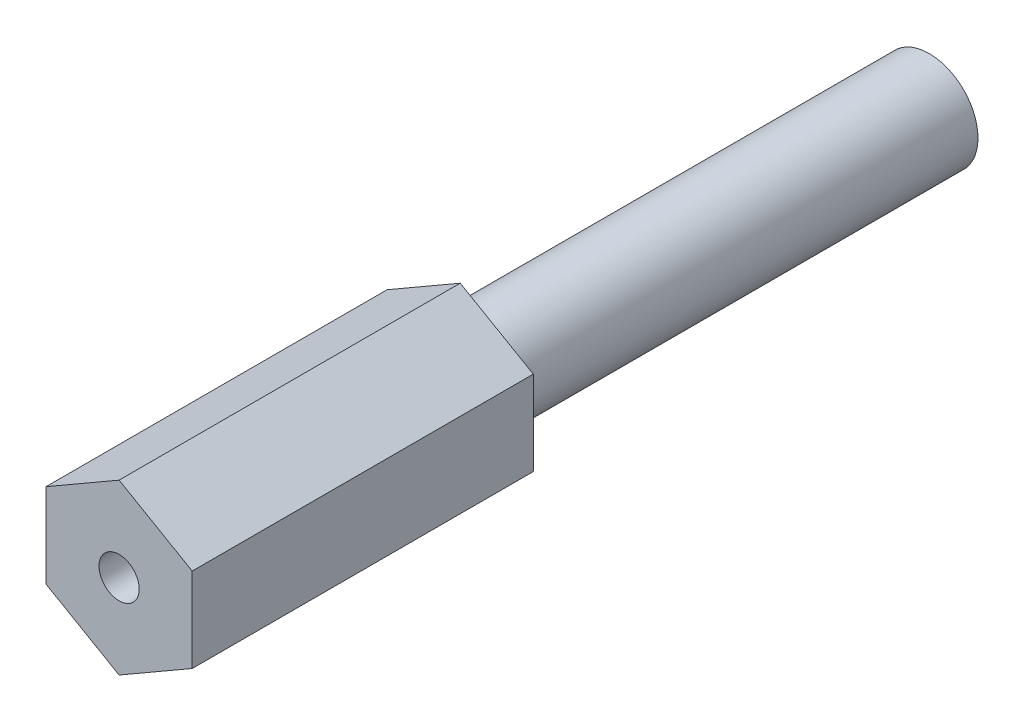
ISO-10303-21;
HEADER;
FILE_DESCRIPTION(('STEP AP214'),'2;1');
FILE_NAME('part.step','',(''),(''),'','','');
FILE_SCHEMA(('AUTOMOTIVE_DESIGN { 1 0 10303 214 1 1 1 1 }'));
ENDSEC;
DATA;
#1=APPLICATION_CONTEXT('core data for automotive mechanical design processes');
#2=APPLICATION_PROTOCOL_DEFINITION('international standard','automotive_design',2000,#1);
#3=PRODUCT_CONTEXT('',#1,'mechanical');
#4=PRODUCT('Part','Part','',(#3));
#5=PRODUCT_RELATED_PRODUCT_CATEGORY('part','',(#4));
#6=PRODUCT_DEFINITION_FORMATION('','',#4);
#7=PRODUCT_DEFINITION_CONTEXT('part definition',#1,'design');
#8=PRODUCT_DEFINITION('design','',#6,#7);
#9=PRODUCT_DEFINITION_SHAPE('','',#8);
#10=(LENGTH_UNIT() NAMED_UNIT(*) SI_UNIT(.MILLI.,.METRE.));
#11=(NAMED_UNIT(*) PLANE_ANGLE_UNIT() SI_UNIT($,.RADIAN.));
#12=(NAMED_UNIT(*) SI_UNIT($,.STERADIAN.) SOLID_ANGLE_UNIT());
#13=UNCERTAINTY_MEASURE_WITH_UNIT(LENGTH_MEASURE(1.E-05),#10,'distance_accuracy_value','');
#14=(GEOMETRIC_REPRESENTATION_CONTEXT(3) GLOBAL_UNCERTAINTY_ASSIGNED_CONTEXT((#13)) GLOBAL_UNIT_ASSIGNED_CONTEXT((#10,
#11,#12)) REPRESENTATION_CONTEXT('',''));
#15=CARTESIAN_POINT('',(0.,0.,0.));
#16=DIRECTION('',(0.,0.,1.));
#17=DIRECTION('',(1.,0.,0.));
#18=AXIS2_PLACEMENT_3D('',#15,#16,#17);
#19=CARTESIAN_POINT('',(-6.00000000000001,10.3923048454134,0.));
#20=DIRECTION('',(0.,0.,1.));
#21=DIRECTION('',(1.,0.,0.));
#22=AXIS2_PLACEMENT_3D('',#19,#20,#21);
#23=PLANE('',#22);
#24=DIRECTION('',(-0.866025403784439,0.499999999999999,0.));
#25=VECTOR('',#24,1.);
#26=CARTESIAN_POINT('',(5.99999999999999,3.46410161513795,0.));
#27=LINE('',#26,#25);
#28=CARTESIAN_POINT('',(5.99999999999999,3.46410161513795,0.));
#29=VERTEX_POINT('',#28);
#30=CARTESIAN_POINT('',(0.,6.92820323027571,0.));
#31=VERTEX_POINT('',#30);
#32=EDGE_CURVE('E114',#29,#31,#27,.T.);
#33=ORIENTED_EDGE('',*,*,#32,.F.);
#34=DIRECTION('',(0.,1.,0.));
#35=VECTOR('',#34,1.);
#36=CARTESIAN_POINT('',(5.99999999999999,-3.46410161513754,0.));
#37=LINE('',#36,#35);
#38=CARTESIAN_POINT('',(5.99999999999999,-3.46410161513754,0.));
#39=VERTEX_POINT('',#38);
#40=EDGE_CURVE('E125',#39,#29,#37,.T.);
#41=ORIENTED_EDGE('',*,*,#40,.F.);
#42=DIRECTION('',(0.866025403784439,0.499999999999999,0.));
#43=VECTOR('',#42,1.);
#44=CARTESIAN_POINT('',(0.,-6.92820323027528,0.));
#45=LINE('',#44,#43);
#46=CARTESIAN_POINT('',(0.,-6.92820323027528,0.));
#47=VERTEX_POINT('',#46);
#48=EDGE_CURVE('E123',#47,#39,#45,.T.);
#49=ORIENTED_EDGE('',*,*,#48,.F.);
#50=DIRECTION('',(0.866025403784439,-0.499999999999998,0.));
#51=VECTOR('',#50,1.);
#52=CARTESIAN_POINT('',(-6.00000000000001,-3.46410161513754,0.));
#53=LINE('',#52,#51);
#54=CARTESIAN_POINT('',(-6.00000000000001,-3.46410161513754,0.));
#55=VERTEX_POINT('',#54);
#56=EDGE_CURVE('E121',#55,#47,#53,.T.);
#57=ORIENTED_EDGE('',*,*,#56,.F.);
#58=DIRECTION('',(0.,-1.,0.));
#59=VECTOR('',#58,1.);
#60=CARTESIAN_POINT('',(-6.00000000000001,3.46410161513797,0.));
#61=LINE('',#60,#59);
#62=CARTESIAN_POINT('',(-6.00000000000001,3.46410161513797,0.));
#63=VERTEX_POINT('',#62);
#64=EDGE_CURVE('E119',#63,#55,#61,.T.);
#65=ORIENTED_EDGE('',*,*,#64,.F.);
#66=DIRECTION('',(-0.866025403784439,-0.5,0.));
#67=VECTOR('',#66,1.);
#68=CARTESIAN_POINT('',(0.,6.92820323027571,0.));
#69=LINE('',#68,#67);
#70=EDGE_CURVE('E117',#31,#63,#69,.T.);
#71=ORIENTED_EDGE('',*,*,#70,.F.);
#72=EDGE_LOOP('',(#33,#41,#49,#57,#65,#71));
#73=FACE_BOUND('',#72,.T.);
#74=CARTESIAN_POINT('',(0.,0.,0.));
#75=DIRECTION('',(0.,0.,1.));
#76=DIRECTION('',(1.,0.,0.));
#77=AXIS2_PLACEMENT_3D('',#74,#75,#76);
#78=CIRCLE('',#77,4.);
#79=CARTESIAN_POINT('',(4.,0.,0.));
#80=VERTEX_POINT('',#79);
#81=EDGE_CURVE('E11',#80,#80,#78,.F.);
#82=ORIENTED_EDGE('',*,*,#81,.F.);
#83=EDGE_LOOP('',(#82));
#84=FACE_BOUND('',#83,.T.);
#85=ADVANCED_FACE('F34',(#73,#84),#23,.F.);
#86=CARTESIAN_POINT('',(5.99999999999999,3.46410161513795,28.));
#87=DIRECTION('',(-0.499999999999999,-0.866025403784439,0.));
#88=DIRECTION('',(0.866025403784439,-0.5,0.));
#89=AXIS2_PLACEMENT_3D('',#86,#87,#88);
#90=PLANE('',#89);
#91=ORIENTED_EDGE('',*,*,#32,.T.);
#92=DIRECTION('',(0.,0.,-1.));
#93=VECTOR('',#92,1.);
#94=CARTESIAN_POINT('',(0.,6.92820323027571,28.));
#95=LINE('',#94,#93);
#96=CARTESIAN_POINT('',(0.,6.92820323027571,28.));
#97=VERTEX_POINT('',#96);
#98=EDGE_CURVE('E42',#97,#31,#95,.T.);
#99=ORIENTED_EDGE('',*,*,#98,.F.);
#100=DIRECTION('',(-0.866025403784439,0.499999999999999,0.));
#101=VECTOR('',#100,1.);
#102=CARTESIAN_POINT('',(5.99999999999999,3.46410161513795,28.));
#103=LINE('',#102,#101);
#104=CARTESIAN_POINT('',(5.99999999999999,3.46410161513795,28.));
#105=VERTEX_POINT('',#104);
#106=EDGE_CURVE('E127',#105,#97,#103,.T.);
#107=ORIENTED_EDGE('',*,*,#106,.F.);
#108=DIRECTION('',(0.,0.,-1.));
#109=VECTOR('',#108,1.);
#110=CARTESIAN_POINT('',(5.99999999999999,3.46410161513795,28.));
#111=LINE('',#110,#109);
#112=EDGE_CURVE('E137',#105,#29,#111,.T.);
#113=ORIENTED_EDGE('',*,*,#112,.T.);
#114=EDGE_LOOP('',(#91,#99,#107,#113));
#115=FACE_BOUND('',#114,.T.);
#116=ADVANCED_FACE('F36',(#115),#90,.F.);
#117=CARTESIAN_POINT('',(0.,6.92820323027571,28.));
#118=DIRECTION('',(0.5,-0.866025403784439,0.));
#119=DIRECTION('',(0.866025403784439,0.5,0.));
#120=AXIS2_PLACEMENT_3D('',#117,#118,#119);
#121=PLANE('',#120);
#122=ORIENTED_EDGE('',*,*,#70,.T.);
#123=DIRECTION('',(0.,0.,-1.));
#124=VECTOR('',#123,1.);
#125=CARTESIAN_POINT('',(-6.00000000000001,3.46410161513797,28.));
#126=LINE('',#125,#124);
#127=CARTESIAN_POINT('',(-6.00000000000001,3.46410161513797,28.));
#128=VERTEX_POINT('',#127);
#129=EDGE_CURVE('E149',#128,#63,#126,.T.);
#130=ORIENTED_EDGE('',*,*,#129,.F.);
#131=DIRECTION('',(-0.866025403784439,-0.5,0.));
#132=VECTOR('',#131,1.);
#133=CARTESIAN_POINT('',(0.,6.92820323027571,28.));
#134=LINE('',#133,#132);
#135=EDGE_CURVE('E129',#97,#128,#134,.T.);
#136=ORIENTED_EDGE('',*,*,#135,.F.);
#137=ORIENTED_EDGE('',*,*,#98,.T.);
#138=EDGE_LOOP('',(#122,#130,#136,#137));
#139=FACE_BOUND('',#138,.T.);
#140=ADVANCED_FACE('F154',(#139),#121,.F.);
#141=CARTESIAN_POINT('',(-6.00000000000001,3.46410161513797,28.));
#142=DIRECTION('',(1.,0.,0.));
#143=DIRECTION('',(0.,0.,-1.));
#144=AXIS2_PLACEMENT_3D('',#141,#142,#143);
#145=PLANE('',#144);
#146=ORIENTED_EDGE('',*,*,#64,.T.);
#147=DIRECTION('',(0.,0.,-1.));
#148=VECTOR('',#147,1.);
#149=CARTESIAN_POINT('',(-6.00000000000001,-3.46410161513754,28.));
#150=LINE('',#149,#148);
#151=CARTESIAN_POINT('',(-6.00000000000001,-3.46410161513754,28.));
#152=VERTEX_POINT('',#151);
#153=EDGE_CURVE('E146',#152,#55,#150,.T.);
#154=ORIENTED_EDGE('',*,*,#153,.F.);
#155=DIRECTION('',(0.,-1.,0.));
#156=VECTOR('',#155,1.);
#157=CARTESIAN_POINT('',(-6.00000000000001,3.46410161513797,28.));
#158=LINE('',#157,#156);
#159=EDGE_CURVE('E131',#128,#152,#158,.T.);
#160=ORIENTED_EDGE('',*,*,#159,.F.);
#161=ORIENTED_EDGE('',*,*,#129,.T.);
#162=EDGE_LOOP('',(#146,#154,#160,#161));
#163=FACE_BOUND('',#162,.T.);
#164=ADVANCED_FACE('F167',(#163),#145,.F.);
#165=CARTESIAN_POINT('',(-6.00000000000001,-3.46410161513754,28.));
#166=DIRECTION('',(0.499999999999998,0.866025403784439,0.));
#167=DIRECTION('',(-0.86602540378444,0.499999999999998,0.));
#168=AXIS2_PLACEMENT_3D('',#165,#166,#167);
#169=PLANE('',#168);
#170=ORIENTED_EDGE('',*,*,#56,.T.);
#171=DIRECTION('',(0.,0.,-1.));
#172=VECTOR('',#171,1.);
#173=CARTESIAN_POINT('',(0.,-6.92820323027528,28.));
#174=LINE('',#173,#172);
#175=CARTESIAN_POINT('',(0.,-6.92820323027528,28.));
#176=VERTEX_POINT('',#175);
#177=EDGE_CURVE('E143',#176,#47,#174,.T.);
#178=ORIENTED_EDGE('',*,*,#177,.F.);
#179=DIRECTION('',(0.866025403784439,-0.499999999999998,0.));
#180=VECTOR('',#179,1.);
#181=CARTESIAN_POINT('',(-6.00000000000001,-3.46410161513754,28.));
#182=LINE('',#181,#180);
#183=EDGE_CURVE('E133',#152,#176,#182,.T.);
#184=ORIENTED_EDGE('',*,*,#183,.F.);
#185=ORIENTED_EDGE('',*,*,#153,.T.);
#186=EDGE_LOOP('',(#170,#178,#184,#185));
#187=FACE_BOUND('',#186,.T.);
#188=ADVANCED_FACE('F171',(#187),#169,.F.);
#189=CARTESIAN_POINT('',(0.,-6.92820323027528,28.));
#190=DIRECTION('',(-0.499999999999999,0.866025403784439,0.));
#191=DIRECTION('',(-0.866025403784439,-0.5,0.));
#192=AXIS2_PLACEMENT_3D('',#189,#190,#191);
#193=PLANE('',#192);
#194=ORIENTED_EDGE('',*,*,#48,.T.);
#195=DIRECTION('',(0.,0.,-1.));
#196=VECTOR('',#195,1.);
#197=CARTESIAN_POINT('',(5.99999999999999,-3.46410161513754,28.));
#198=LINE('',#197,#196);
#199=CARTESIAN_POINT('',(5.99999999999999,-3.46410161513754,28.));
#200=VERTEX_POINT('',#199);
#201=EDGE_CURVE('E140',#200,#39,#198,.T.);
#202=ORIENTED_EDGE('',*,*,#201,.F.);
#203=DIRECTION('',(0.866025403784439,0.499999999999999,0.));
#204=VECTOR('',#203,1.);
#205=CARTESIAN_POINT('',(0.,-6.92820323027528,28.));
#206=LINE('',#205,#204);
#207=EDGE_CURVE('E54',#176,#200,#206,.T.);
#208=ORIENTED_EDGE('',*,*,#207,.F.);
#209=ORIENTED_EDGE('',*,*,#177,.T.);
#210=EDGE_LOOP('',(#194,#202,#208,#209));
#211=FACE_BOUND('',#210,.T.);
#212=ADVANCED_FACE('F186',(#211),#193,.F.);
#213=CARTESIAN_POINT('',(5.99999999999999,-3.46410161513754,28.));
#214=DIRECTION('',(-1.,0.,0.));
#215=DIRECTION('',(0.,0.,1.));
#216=AXIS2_PLACEMENT_3D('',#213,#214,#215);
#217=PLANE('',#216);
#218=ORIENTED_EDGE('',*,*,#40,.T.);
#219=ORIENTED_EDGE('',*,*,#112,.F.);
#220=DIRECTION('',(0.,1.,0.));
#221=VECTOR('',#220,1.);
#222=CARTESIAN_POINT('',(5.99999999999999,-3.46410161513754,28.));
#223=LINE('',#222,#221);
#224=EDGE_CURVE('E49',#200,#105,#223,.T.);
#225=ORIENTED_EDGE('',*,*,#224,.F.);
#226=ORIENTED_EDGE('',*,*,#201,.T.);
#227=EDGE_LOOP('',(#218,#219,#225,#226));
#228=FACE_BOUND('',#227,.T.);
#229=ADVANCED_FACE('F176',(#228),#217,.F.);
#230=CARTESIAN_POINT('',(-6.00000000000001,10.3923048454134,28.));
#231=DIRECTION('',(0.,0.,1.));
#232=DIRECTION('',(1.,0.,0.));
#233=AXIS2_PLACEMENT_3D('',#230,#231,#232);
#234=PLANE('',#233);
#235=CARTESIAN_POINT('',(0.,0.,28.));
#236=DIRECTION('',(0.,0.,1.));
#237=DIRECTION('',(1.,0.,0.));
#238=AXIS2_PLACEMENT_3D('',#235,#236,#237);
#239=CIRCLE('',#238,1.64999999999999);
#240=CARTESIAN_POINT('',(1.64999999999999,0.,28.));
#241=VERTEX_POINT('',#240);
#242=EDGE_CURVE('E108',#241,#241,#239,.T.);
#243=ORIENTED_EDGE('',*,*,#242,.F.);
#244=EDGE_LOOP('',(#243));
#245=FACE_BOUND('',#244,.T.);
#246=ORIENTED_EDGE('',*,*,#106,.T.);
#247=ORIENTED_EDGE('',*,*,#135,.T.);
#248=ORIENTED_EDGE('',*,*,#159,.T.);
#249=ORIENTED_EDGE('',*,*,#183,.T.);
#250=ORIENTED_EDGE('',*,*,#207,.T.);
#251=ORIENTED_EDGE('',*,*,#224,.T.);
#252=EDGE_LOOP('',(#246,#247,#248,#249,#250,#251));
#253=FACE_BOUND('',#252,.T.);
#254=ADVANCED_FACE('F173',(#245,#253),#234,.T.);
#255=CARTESIAN_POINT('',(0.,0.,-38.5));
#256=DIRECTION('',(0.,0.,1.));
#257=DIRECTION('',(1.,0.,0.));
#258=AXIS2_PLACEMENT_3D('',#255,#256,#257);
#259=CYLINDRICAL_SURFACE('',#258,4.);
#260=CARTESIAN_POINT('',(0.,0.,-38.5));
#261=DIRECTION('',(0.,0.,-1.));
#262=DIRECTION('',(-1.,0.,0.));
#263=AXIS2_PLACEMENT_3D('',#260,#261,#262);
#264=CIRCLE('',#263,4.);
#265=CARTESIAN_POINT('',(-4.,0.,-38.5));
#266=VERTEX_POINT('',#265);
#267=EDGE_CURVE('E111',#266,#266,#264,.T.);
#268=ORIENTED_EDGE('',*,*,#267,.F.);
#269=EDGE_LOOP('',(#268));
#270=FACE_BOUND('',#269,.T.);
#271=ORIENTED_EDGE('',*,*,#81,.T.);
#272=EDGE_LOOP('',(#271));
#273=FACE_BOUND('',#272,.T.);
#274=ADVANCED_FACE('F175',(#270,#273),#259,.T.);
#275=CARTESIAN_POINT('',(0.,0.,-38.5));
#276=DIRECTION('',(0.,0.,-1.));
#277=DIRECTION('',(-1.,0.,0.));
#278=AXIS2_PLACEMENT_3D('',#275,#276,#277);
#279=PLANE('',#278);
#280=CARTESIAN_POINT('',(0.,0.,-38.5));
#281=DIRECTION('',(0.,0.,-1.));
#282=DIRECTION('',(-1.,0.,0.));
#283=AXIS2_PLACEMENT_3D('',#280,#281,#282);
#284=CIRCLE('',#283,1.64999999999999);
#285=CARTESIAN_POINT('',(-1.64999999999999,0.,-38.5));
#286=VERTEX_POINT('',#285);
#287=EDGE_CURVE('E100',#286,#286,#284,.T.);
#288=ORIENTED_EDGE('',*,*,#287,.F.);
#289=EDGE_LOOP('',(#288));
#290=FACE_BOUND('',#289,.T.);
#291=ORIENTED_EDGE('',*,*,#267,.T.);
#292=EDGE_LOOP('',(#291));
#293=FACE_BOUND('',#292,.T.);
#294=ADVANCED_FACE('F183',(#290,#293),#279,.T.);
#295=CARTESIAN_POINT('',(0.,0.,28.));
#296=DIRECTION('',(0.,0.,1.));
#297=DIRECTION('',(1.,0.,0.));
#298=AXIS2_PLACEMENT_3D('',#295,#296,#297);
#299=CYLINDRICAL_SURFACE('',#298,1.64999999999999);
#300=CARTESIAN_POINT('',(0.,0.,3.));
#301=DIRECTION('',(0.,0.,1.));
#302=DIRECTION('',(1.,0.,0.));
#303=AXIS2_PLACEMENT_3D('',#300,#301,#302);
#304=CIRCLE('',#303,1.64999999999999);
#305=CARTESIAN_POINT('',(1.64999999999999,0.,3.));
#306=VERTEX_POINT('',#305);
#307=EDGE_CURVE('E103',#306,#306,#304,.T.);
#308=ORIENTED_EDGE('',*,*,#307,.F.);
#309=EDGE_LOOP('',(#308));
#310=FACE_BOUND('',#309,.T.);
#311=ORIENTED_EDGE('',*,*,#242,.T.);
#312=EDGE_LOOP('',(#311));
#313=FACE_BOUND('',#312,.T.);
#314=ADVANCED_FACE('F198',(#310,#313),#299,.F.);
#315=CARTESIAN_POINT('',(0.,0.,3.));
#316=DIRECTION('',(0.,0.,1.));
#317=DIRECTION('',(1.,0.,0.));
#318=AXIS2_PLACEMENT_3D('',#315,#316,#317);
#319=CONICAL_SURFACE('',#318,1.64999999999999,1.02974425867665);
#320=CARTESIAN_POINT('',(0.,0.,2.00857997860452));
#321=VERTEX_POINT('',#320);
#322=VERTEX_LOOP('',#321);
#323=FACE_BOUND('',#322,.T.);
#324=ORIENTED_EDGE('',*,*,#307,.T.);
#325=EDGE_LOOP('',(#324));
#326=FACE_BOUND('',#325,.T.);
#327=ADVANCED_FACE('F202',(#323,#326),#319,.F.);
#328=CARTESIAN_POINT('',(0.,0.,-38.5));
#329=DIRECTION('',(0.,0.,-1.));
#330=DIRECTION('',(-1.,0.,0.));
#331=AXIS2_PLACEMENT_3D('',#328,#329,#330);
#332=CYLINDRICAL_SURFACE('',#331,1.64999999999999);
#333=CARTESIAN_POINT('',(0.,0.,-13.5));
#334=DIRECTION('',(0.,0.,-1.));
#335=DIRECTION('',(-1.,0.,0.));
#336=AXIS2_PLACEMENT_3D('',#333,#334,#335);
#337=CIRCLE('',#336,1.64999999999999);
#338=CARTESIAN_POINT('',(-1.64999999999999,0.,-13.5));
#339=VERTEX_POINT('',#338);
#340=EDGE_CURVE('E98',#339,#339,#337,.T.);
#341=ORIENTED_EDGE('',*,*,#340,.F.);
#342=EDGE_LOOP('',(#341));
#343=FACE_BOUND('',#342,.T.);
#344=ORIENTED_EDGE('',*,*,#287,.T.);
#345=EDGE_LOOP('',(#344));
#346=FACE_BOUND('',#345,.T.);
#347=ADVANCED_FACE('F94',(#343,#346),#332,.F.);
#348=CARTESIAN_POINT('',(0.,0.,-13.5));
#349=DIRECTION('',(0.,0.,-1.));
#350=DIRECTION('',(-1.,0.,0.));
#351=AXIS2_PLACEMENT_3D('',#348,#349,#350);
#352=CONICAL_SURFACE('',#351,1.64999999999999,1.02974425867665);
#353=CARTESIAN_POINT('',(0.,0.,-12.5085799786045));
#354=VERTEX_POINT('',#353);
#355=VERTEX_LOOP('',#354);
#356=FACE_BOUND('',#355,.T.);
#357=ORIENTED_EDGE('',*,*,#340,.T.);
#358=EDGE_LOOP('',(#357));
#359=FACE_BOUND('',#358,.T.);
#360=ADVANCED_FACE('F91',(#356,#359),#352,.F.);
#361=CLOSED_SHELL('',(#85,#116,#140,#164,#188,#212,#229,#254,#274,#294,#314,#327,#347,#360));
#362=MANIFOLD_SOLID_BREP('B2',#361);
#363=ADVANCED_BREP_SHAPE_REPRESENTATION('',(#18,#362),#14);
#364=SHAPE_DEFINITION_REPRESENTATION(#9,#363);
ENDSEC;
END-ISO-10303-21;
